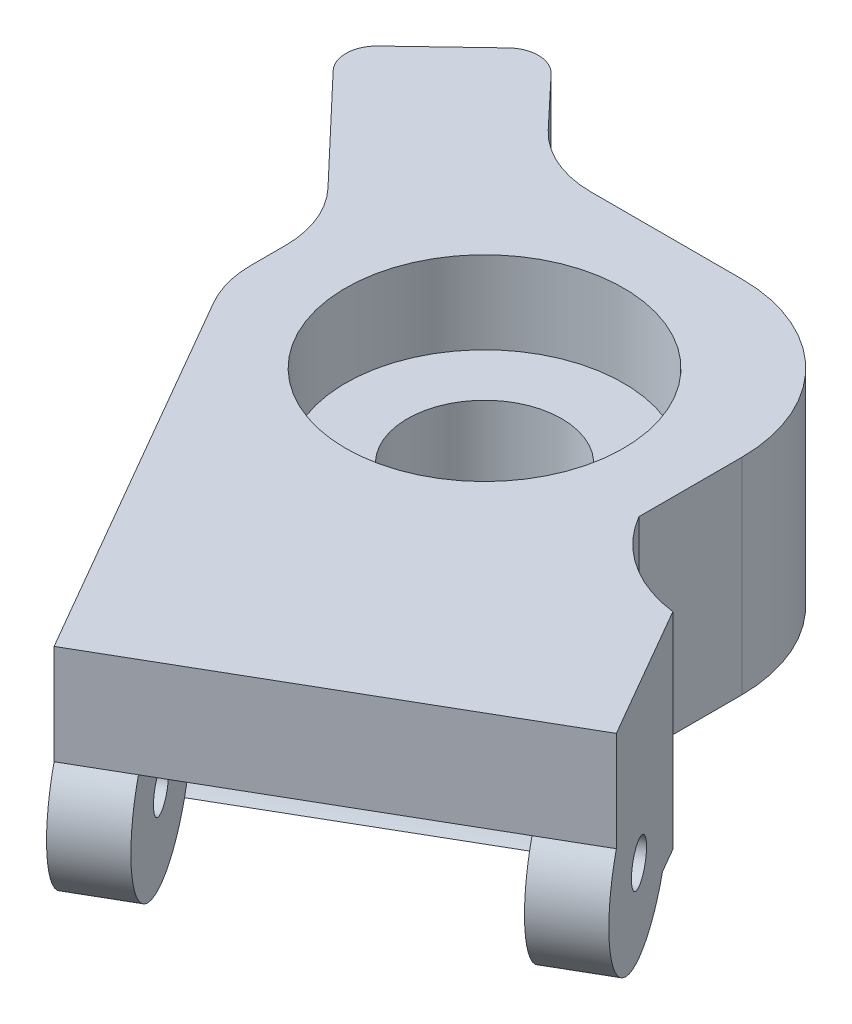
ISO-10303-21;
HEADER;
FILE_DESCRIPTION(('STEP AP214'),'2;1');
FILE_NAME('part.step','',(''),(''),'','','');
FILE_SCHEMA(('AUTOMOTIVE_DESIGN { 1 0 10303 214 1 1 1 1 }'));
ENDSEC;
DATA;
#1=APPLICATION_CONTEXT('core data for automotive mechanical design processes');
#2=APPLICATION_PROTOCOL_DEFINITION('international standard','automotive_design',2000,#1);
#3=PRODUCT_CONTEXT('',#1,'mechanical');
#4=PRODUCT('Part','Part','',(#3));
#5=PRODUCT_RELATED_PRODUCT_CATEGORY('part','',(#4));
#6=PRODUCT_DEFINITION_FORMATION('','',#4);
#7=PRODUCT_DEFINITION_CONTEXT('part definition',#1,'design');
#8=PRODUCT_DEFINITION('design','',#6,#7);
#9=PRODUCT_DEFINITION_SHAPE('','',#8);
#10=(LENGTH_UNIT() NAMED_UNIT(*) SI_UNIT(.MILLI.,.METRE.));
#11=(NAMED_UNIT(*) PLANE_ANGLE_UNIT() SI_UNIT($,.RADIAN.));
#12=(NAMED_UNIT(*) SI_UNIT($,.STERADIAN.) SOLID_ANGLE_UNIT());
#13=UNCERTAINTY_MEASURE_WITH_UNIT(LENGTH_MEASURE(1.E-05),#10,'distance_accuracy_value','');
#14=(GEOMETRIC_REPRESENTATION_CONTEXT(3) GLOBAL_UNCERTAINTY_ASSIGNED_CONTEXT((#13)) GLOBAL_UNIT_ASSIGNED_CONTEXT((#10,
#11,#12)) REPRESENTATION_CONTEXT('',''));
#15=CARTESIAN_POINT('',(0.,0.,0.));
#16=DIRECTION('',(0.,0.,1.));
#17=DIRECTION('',(1.,0.,0.));
#18=AXIS2_PLACEMENT_3D('',#15,#16,#17);
#19=CARTESIAN_POINT('',(-52.4615242270662,-7.,69.1339745962157));
#20=DIRECTION('',(0.866025403784437,0.,-0.500000000000003));
#21=DIRECTION('',(-0.500000000000003,0.,-0.866025403784437));
#22=AXIS2_PLACEMENT_3D('',#19,#20,#21);
#23=CYLINDRICAL_SURFACE('',#22,2.);
#24=CARTESIAN_POINT('',(-0.499999999999966,-7.,39.1339745962155));
#25=DIRECTION('',(0.866025403784438,0.,-0.500000000000002));
#26=DIRECTION('',(-0.500000000000002,0.,-0.866025403784438));
#27=AXIS2_PLACEMENT_3D('',#24,#25,#26);
#28=CIRCLE('',#27,2.);
#29=CARTESIAN_POINT('',(-1.49999999999997,-7.,37.4019237886466));
#30=VERTEX_POINT('',#29);
#31=EDGE_CURVE('E200',#30,#30,#28,.T.);
#32=ORIENTED_EDGE('',*,*,#31,.F.);
#33=EDGE_LOOP('',(#32));
#34=FACE_BOUND('',#33,.T.);
#35=CARTESIAN_POINT('',(4.69615242270667,-7.,36.1339745962155));
#36=DIRECTION('',(0.866025403784438,0.,-0.500000000000002));
#37=DIRECTION('',(-0.500000000000002,0.,-0.866025403784438));
#38=AXIS2_PLACEMENT_3D('',#35,#36,#37);
#39=CIRCLE('',#38,2.);
#40=CARTESIAN_POINT('',(3.69615242270666,-7.,34.4019237886466));
#41=VERTEX_POINT('',#40);
#42=EDGE_CURVE('E380',#41,#41,#39,.F.);
#43=ORIENTED_EDGE('',*,*,#42,.F.);
#44=EDGE_LOOP('',(#43));
#45=FACE_BOUND('',#44,.T.);
#46=ADVANCED_FACE('F35',(#34,#45),#23,.F.);
#47=CARTESIAN_POINT('',(-0.5,-7.,39.1339745962155));
#48=DIRECTION('',(0.866025403784438,0.,-0.500000000000002));
#49=DIRECTION('',(-0.500000000000002,0.,-0.866025403784438));
#50=AXIS2_PLACEMENT_3D('',#47,#48,#49);
#51=CYLINDRICAL_SURFACE('',#50,8.);
#52=DIRECTION('',(0.866025403784438,0.,-0.500000000000002));
#53=VECTOR('',#52,1.);
#54=CARTESIAN_POINT('',(-3.62249899919921,-12.,33.7256476830195));
#55=LINE('',#54,#53);
#56=CARTESIAN_POINT('',(1.57365342350746,-12.,30.7256476830195));
#57=VERTEX_POINT('',#56);
#58=CARTESIAN_POINT('',(-3.62249899919919,-12.,33.7256476830195));
#59=VERTEX_POINT('',#58);
#60=EDGE_CURVE('E281',#57,#59,#55,.F.);
#61=ORIENTED_EDGE('',*,*,#60,.F.);
#62=CARTESIAN_POINT('',(4.69615242270667,-7.,36.1339745962155));
#63=DIRECTION('',(0.866025403784438,0.,-0.500000000000002));
#64=DIRECTION('',(-0.500000000000002,0.,-0.866025403784438));
#65=AXIS2_PLACEMENT_3D('',#62,#63,#64);
#66=CIRCLE('',#65,7.99999999999999);
#67=CARTESIAN_POINT('',(7.69615242270665,-1.70849737787076,41.3301270189221));
#68=VERTEX_POINT('',#67);
#69=EDGE_CURVE('E388',#68,#57,#66,.T.);
#70=ORIENTED_EDGE('',*,*,#69,.F.);
#71=DIRECTION('',(0.866025403784438,0.,-0.500000000000002));
#72=VECTOR('',#71,1.);
#73=CARTESIAN_POINT('',(2.49999999999999,-1.70849737787078,44.3301270189221));
#74=LINE('',#73,#72);
#75=CARTESIAN_POINT('',(2.50000000000001,-1.70849737787077,44.3301270189221));
#76=VERTEX_POINT('',#75);
#77=EDGE_CURVE('E190',#76,#68,#74,.T.);
#78=ORIENTED_EDGE('',*,*,#77,.F.);
#79=CARTESIAN_POINT('',(-0.5,-7.,39.1339745962155));
#80=DIRECTION('',(0.866025403784438,0.,-0.500000000000002));
#81=DIRECTION('',(-0.500000000000002,0.,-0.866025403784438));
#82=AXIS2_PLACEMENT_3D('',#79,#80,#81);
#83=CIRCLE('',#82,8.);
#84=EDGE_CURVE('E188',#76,#59,#83,.T.);
#85=ORIENTED_EDGE('',*,*,#84,.T.);
#86=EDGE_LOOP('',(#61,#70,#78,#85));
#87=FACE_BOUND('',#86,.T.);
#88=ADVANCED_FACE('F397',(#87),#51,.T.);
#89=CARTESIAN_POINT('',(5.,8.,-5.));
#90=DIRECTION('',(0.,1.,0.));
#91=DIRECTION('',(0.,0.,1.));
#92=AXIS2_PLACEMENT_3D('',#89,#90,#91);
#93=PLANE('',#92);
#94=DIRECTION('',(-0.724880334749482,0.,0.688874807416761));
#95=VECTOR('',#94,1.);
#96=CARTESIAN_POINT('',(-34.466370955752,8.,-19.8635031811167));
#97=LINE('',#96,#95);
#98=CARTESIAN_POINT('',(-25.7787544463453,8.,-28.1195971361231));
#99=VERTEX_POINT('',#98);
#100=CARTESIAN_POINT('',(-32.2917299515036,8.,-21.930127603367));
#101=VERTEX_POINT('',#100);
#102=EDGE_CURVE('E250',#99,#101,#97,.T.);
#103=ORIENTED_EDGE('',*,*,#102,.T.);
#104=CARTESIAN_POINT('',(-30.2251055292533,8.,-19.7554865991186));
#105=DIRECTION('',(0.,1.,0.));
#106=DIRECTION('',(0.,0.,1.));
#107=AXIS2_PLACEMENT_3D('',#104,#105,#106);
#108=CIRCLE('',#107,3.);
#109=CARTESIAN_POINT('',(-32.3997465335018,8.,-17.6888621768683));
#110=VERTEX_POINT('',#109);
#111=EDGE_CURVE('E43',#101,#110,#108,.T.);
#112=ORIENTED_EDGE('',*,*,#111,.T.);
#113=DIRECTION('',(0.68887480741676,0.,0.724880334749482));
#114=VECTOR('',#113,1.);
#115=CARTESIAN_POINT('',(-34.466370955752,8.,-19.8635031811167));
#116=LINE('',#115,#114);
#117=CARTESIAN_POINT('',(-22.7511966525053,8.,-7.53601002974002));
#118=VERTEX_POINT('',#117);
#119=EDGE_CURVE('E253',#110,#118,#116,.T.);
#120=ORIENTED_EDGE('',*,*,#119,.T.);
#121=CARTESIAN_POINT('',(-30.0000000000001,8.,-0.647261955572413));
#122=DIRECTION('',(0.,1.,0.));
#123=DIRECTION('',(0.,0.,1.));
#124=AXIS2_PLACEMENT_3D('',#121,#122,#123);
#125=CIRCLE('',#124,10.);
#126=CARTESIAN_POINT('',(-20.0000000000001,8.,-0.647261955572417));
#127=VERTEX_POINT('',#126);
#128=EDGE_CURVE('E310',#118,#127,#125,.F.);
#129=ORIENTED_EDGE('',*,*,#128,.T.);
#130=DIRECTION('',(0.,0.,1.));
#131=VECTOR('',#130,1.);
#132=CARTESIAN_POINT('',(-20.0000000000001,8.,-4.6410161513776));
#133=LINE('',#132,#131);
#134=CARTESIAN_POINT('',(-20.0000000000001,8.,2.67949192431115));
#135=VERTEX_POINT('',#134);
#136=EDGE_CURVE('E255',#127,#135,#133,.T.);
#137=ORIENTED_EDGE('',*,*,#136,.T.);
#138=CARTESIAN_POINT('',(-10.0000000000001,8.,2.67949192431115));
#139=DIRECTION('',(0.,1.,0.));
#140=DIRECTION('',(0.,0.,1.));
#141=AXIS2_PLACEMENT_3D('',#138,#139,#140);
#142=CIRCLE('',#141,10.);
#143=CARTESIAN_POINT('',(-18.6602540378445,8.,7.67949192431117));
#144=VERTEX_POINT('',#143);
#145=EDGE_CURVE('E302',#135,#144,#142,.T.);
#146=ORIENTED_EDGE('',*,*,#145,.T.);
#147=DIRECTION('',(0.500000000000002,0.,0.866025403784438));
#148=VECTOR('',#147,1.);
#149=CARTESIAN_POINT('',(2.50000000000001,8.,44.3301270189221));
#150=LINE('',#149,#148);
#151=CARTESIAN_POINT('',(2.50000000000001,8.,44.3301270189221));
#152=VERTEX_POINT('',#151);
#153=EDGE_CURVE('E258',#144,#152,#150,.T.);
#154=ORIENTED_EDGE('',*,*,#153,.T.);
#155=DIRECTION('',(0.866025403784438,0.,-0.500000000000001));
#156=VECTOR('',#155,1.);
#157=CARTESIAN_POINT('',(2.50000000000001,8.,44.3301270189221));
#158=LINE('',#157,#156);
#159=CARTESIAN_POINT('',(37.1410161513775,8.,24.330127018922));
#160=VERTEX_POINT('',#159);
#161=EDGE_CURVE('E260',#152,#160,#158,.T.);
#162=ORIENTED_EDGE('',*,*,#161,.T.);
#163=DIRECTION('',(-0.500000000000002,0.,-0.866025403784438));
#164=VECTOR('',#163,1.);
#165=CARTESIAN_POINT('',(37.1410161513775,8.,24.330127018922));
#166=LINE('',#165,#164);
#167=CARTESIAN_POINT('',(29.6410161513775,8.,11.3397459621555));
#168=VERTEX_POINT('',#167);
#169=EDGE_CURVE('E262',#160,#168,#166,.T.);
#170=ORIENTED_EDGE('',*,*,#169,.T.);
#171=CARTESIAN_POINT('',(31.2212204760018,8.,-1.56385641440739));
#172=DIRECTION('',(0.,-1.,0.));
#173=DIRECTION('',(0.,0.,1.));
#174=AXIS2_PLACEMENT_3D('',#171,#172,#173);
#175=CIRCLE('',#174,13.);
#176=CARTESIAN_POINT('',(19.9999999999999,8.,5.));
#177=VERTEX_POINT('',#176);
#178=EDGE_CURVE('E264',#168,#177,#175,.T.);
#179=ORIENTED_EDGE('',*,*,#178,.T.);
#180=DIRECTION('',(0.,0.,-1.));
#181=VECTOR('',#180,1.);
#182=CARTESIAN_POINT('',(20.,8.,-4.9999999999999));
#183=LINE('',#182,#181);
#184=CARTESIAN_POINT('',(20.,8.,-4.9999999999999));
#185=VERTEX_POINT('',#184);
#186=EDGE_CURVE('E266',#177,#185,#183,.T.);
#187=ORIENTED_EDGE('',*,*,#186,.T.);
#188=CARTESIAN_POINT('',(5.,8.,-5.));
#189=DIRECTION('',(0.,1.,0.));
#190=DIRECTION('',(0.,0.,1.));
#191=AXIS2_PLACEMENT_3D('',#188,#189,#190);
#192=CIRCLE('',#191,15.);
#193=CARTESIAN_POINT('',(4.9999999999999,8.,-20.));
#194=VERTEX_POINT('',#193);
#195=EDGE_CURVE('E240',#185,#194,#192,.T.);
#196=ORIENTED_EDGE('',*,*,#195,.T.);
#197=DIRECTION('',(-1.,0.,0.));
#198=VECTOR('',#197,1.);
#199=CARTESIAN_POINT('',(-14.,8.,-20.));
#200=LINE('',#199,#198);
#201=CARTESIAN_POINT('',(-9.67814454377507,8.,-20.));
#202=VERTEX_POINT('',#201);
#203=EDGE_CURVE('E245',#194,#202,#200,.T.);
#204=ORIENTED_EDGE('',*,*,#203,.T.);
#205=CARTESIAN_POINT('',(-9.67814454377507,8.,-30.));
#206=DIRECTION('',(0.,1.,0.));
#207=DIRECTION('',(0.,0.,1.));
#208=AXIS2_PLACEMENT_3D('',#205,#206,#207);
#209=CIRCLE('',#208,10.);
#210=CARTESIAN_POINT('',(-16.961448324038,8.,-23.1477386182073));
#211=VERTEX_POINT('',#210);
#212=EDGE_CURVE('E306',#202,#211,#209,.F.);
#213=ORIENTED_EDGE('',*,*,#212,.T.);
#214=DIRECTION('',(-0.68522613817927,0.,-0.728330378026294));
#215=VECTOR('',#214,1.);
#216=CARTESIAN_POINT('',(-14.,8.,-20.));
#217=LINE('',#216,#215);
#218=CARTESIAN_POINT('',(-21.5271388900162,8.,-28.0006345464125));
#219=VERTEX_POINT('',#218);
#220=EDGE_CURVE('E248',#211,#219,#217,.T.);
#221=ORIENTED_EDGE('',*,*,#220,.T.);
#222=CARTESIAN_POINT('',(-23.7121300240951,8.,-25.9449561318747));
#223=DIRECTION('',(0.,1.,0.));
#224=DIRECTION('',(0.,0.,1.));
#225=AXIS2_PLACEMENT_3D('',#222,#223,#224);
#226=CIRCLE('',#225,3.);
#227=EDGE_CURVE('E324',#219,#99,#226,.T.);
#228=ORIENTED_EDGE('',*,*,#227,.T.);
#229=EDGE_LOOP('',(#103,#112,#120,#129,#137,#146,#154,#162,#170,#179,#187,#196,#204,#213,#221,#228));
#230=FACE_BOUND('',#229,.T.);
#231=CARTESIAN_POINT('',(0.,8.,0.));
#232=DIRECTION('',(0.,1.,0.));
#233=DIRECTION('',(0.,0.,1.));
#234=AXIS2_PLACEMENT_3D('',#231,#232,#233);
#235=CIRCLE('',#234,13.5);
#236=CARTESIAN_POINT('',(0.,8.,13.5));
#237=VERTEX_POINT('',#236);
#238=EDGE_CURVE('E237',#237,#237,#235,.T.);
#239=ORIENTED_EDGE('',*,*,#238,.F.);
#240=EDGE_LOOP('',(#239));
#241=FACE_BOUND('',#240,.T.);
#242=ADVANCED_FACE('F328',(#230,#241),#93,.T.);
#243=CARTESIAN_POINT('',(5.,8.,-5.));
#244=DIRECTION('',(0.,-1.,0.));
#245=DIRECTION('',(0.,0.,-1.));
#246=AXIS2_PLACEMENT_3D('',#243,#244,#245);
#247=CYLINDRICAL_SURFACE('',#246,15.);
#248=DIRECTION('',(0.,-1.,0.));
#249=VECTOR('',#248,1.);
#250=CARTESIAN_POINT('',(20.,8.,-4.9999999999999));
#251=LINE('',#250,#249);
#252=CARTESIAN_POINT('',(20.,-12.,-5.));
#253=VERTEX_POINT('',#252);
#254=EDGE_CURVE('E268',#185,#253,#251,.T.);
#255=ORIENTED_EDGE('',*,*,#254,.T.);
#256=CARTESIAN_POINT('',(5.,-12.,-5.));
#257=DIRECTION('',(0.,-1.,0.));
#258=DIRECTION('',(0.,0.,1.));
#259=AXIS2_PLACEMENT_3D('',#256,#257,#258);
#260=CIRCLE('',#259,15.);
#261=CARTESIAN_POINT('',(5.00000000000001,-12.,-20.));
#262=VERTEX_POINT('',#261);
#263=EDGE_CURVE('E225',#262,#253,#260,.T.);
#264=ORIENTED_EDGE('',*,*,#263,.F.);
#265=DIRECTION('',(0.,-1.,0.));
#266=VECTOR('',#265,1.);
#267=CARTESIAN_POINT('',(4.9999999999999,8.,-20.));
#268=LINE('',#267,#266);
#269=EDGE_CURVE('E278',#194,#262,#268,.T.);
#270=ORIENTED_EDGE('',*,*,#269,.F.);
#271=ORIENTED_EDGE('',*,*,#195,.F.);
#272=EDGE_LOOP('',(#255,#264,#270,#271));
#273=FACE_BOUND('',#272,.T.);
#274=ADVANCED_FACE('F363',(#273),#247,.T.);
#275=CARTESIAN_POINT('',(-14.,8.,-20.));
#276=DIRECTION('',(0.,0.,1.));
#277=DIRECTION('',(1.,0.,0.));
#278=AXIS2_PLACEMENT_3D('',#275,#276,#277);
#279=PLANE('',#278);
#280=DIRECTION('',(1.,0.,0.));
#281=VECTOR('',#280,1.);
#282=CARTESIAN_POINT('',(5.00000000000001,-12.,-20.));
#283=LINE('',#282,#281);
#284=CARTESIAN_POINT('',(-9.67814454377507,-12.,-20.));
#285=VERTEX_POINT('',#284);
#286=EDGE_CURVE('E223',#285,#262,#283,.T.);
#287=ORIENTED_EDGE('',*,*,#286,.F.);
#288=DIRECTION('',(0.,-1.,0.));
#289=VECTOR('',#288,1.);
#290=CARTESIAN_POINT('',(-9.67814454377507,8.,-20.));
#291=LINE('',#290,#289);
#292=EDGE_CURVE('E287',#285,#202,#291,.F.);
#293=ORIENTED_EDGE('',*,*,#292,.T.);
#294=ORIENTED_EDGE('',*,*,#203,.F.);
#295=ORIENTED_EDGE('',*,*,#269,.T.);
#296=EDGE_LOOP('',(#287,#293,#294,#295));
#297=FACE_BOUND('',#296,.T.);
#298=ADVANCED_FACE('F358',(#297),#279,.F.);
#299=CARTESIAN_POINT('',(-14.,8.,-20.));
#300=DIRECTION('',(-0.728330378026294,0.,0.68522613817927));
#301=DIRECTION('',(0.68522613817927,0.,0.728330378026294));
#302=AXIS2_PLACEMENT_3D('',#299,#300,#301);
#303=PLANE('',#302);
#304=DIRECTION('',(0.68522613817927,0.,0.728330378026293));
#305=VECTOR('',#304,1.);
#306=CARTESIAN_POINT('',(-14.,-12.,-20.));
#307=LINE('',#306,#305);
#308=CARTESIAN_POINT('',(-21.5271388900162,-12.,-28.0006345464125));
#309=VERTEX_POINT('',#308);
#310=CARTESIAN_POINT('',(-16.961448324038,-12.,-23.1477386182073));
#311=VERTEX_POINT('',#310);
#312=EDGE_CURVE('E221',#309,#311,#307,.T.);
#313=ORIENTED_EDGE('',*,*,#312,.F.);
#314=DIRECTION('',(0.,-1.,0.));
#315=VECTOR('',#314,1.);
#316=CARTESIAN_POINT('',(-21.5271388900162,8.,-28.0006345464125));
#317=LINE('',#316,#315);
#318=EDGE_CURVE('E11',#309,#219,#317,.F.);
#319=ORIENTED_EDGE('',*,*,#318,.T.);
#320=ORIENTED_EDGE('',*,*,#220,.F.);
#321=DIRECTION('',(0.,-1.,0.));
#322=VECTOR('',#321,1.);
#323=CARTESIAN_POINT('',(-16.961448324038,-12.,-23.1477386182073));
#324=LINE('',#323,#322);
#325=EDGE_CURVE('E284',#211,#311,#324,.T.);
#326=ORIENTED_EDGE('',*,*,#325,.T.);
#327=EDGE_LOOP('',(#313,#319,#320,#326));
#328=FACE_BOUND('',#327,.T.);
#329=ADVANCED_FACE('F350',(#328),#303,.F.);
#330=CARTESIAN_POINT('',(-34.466370955752,8.,-19.8635031811167));
#331=DIRECTION('',(0.688874807416761,0.,0.724880334749482));
#332=DIRECTION('',(0.724880334749482,0.,-0.688874807416761));
#333=AXIS2_PLACEMENT_3D('',#330,#331,#332);
#334=PLANE('',#333);
#335=DIRECTION('',(0.724880334749482,0.,-0.68887480741676));
#336=VECTOR('',#335,1.);
#337=CARTESIAN_POINT('',(-23.5931659345098,-12.,-30.1966252923681));
#338=LINE('',#337,#336);
#339=CARTESIAN_POINT('',(-32.2917299515036,-12.,-21.930127603367));
#340=VERTEX_POINT('',#339);
#341=CARTESIAN_POINT('',(-25.7787544463453,-12.,-28.1195971361231));
#342=VERTEX_POINT('',#341);
#343=EDGE_CURVE('E218',#340,#342,#338,.T.);
#344=ORIENTED_EDGE('',*,*,#343,.F.);
#345=DIRECTION('',(0.,-1.,0.));
#346=VECTOR('',#345,1.);
#347=CARTESIAN_POINT('',(-32.2917299515036,8.,-21.930127603367));
#348=LINE('',#347,#346);
#349=EDGE_CURVE('E322',#340,#101,#348,.F.);
#350=ORIENTED_EDGE('',*,*,#349,.T.);
#351=ORIENTED_EDGE('',*,*,#102,.F.);
#352=DIRECTION('',(0.,-1.,0.));
#353=VECTOR('',#352,1.);
#354=CARTESIAN_POINT('',(-25.7787544463453,8.,-28.1195971361231));
#355=LINE('',#354,#353);
#356=EDGE_CURVE('E319',#99,#342,#355,.T.);
#357=ORIENTED_EDGE('',*,*,#356,.T.);
#358=EDGE_LOOP('',(#344,#350,#351,#357));
#359=FACE_BOUND('',#358,.T.);
#360=ADVANCED_FACE('F345',(#359),#334,.F.);
#361=CARTESIAN_POINT('',(-34.466370955752,8.,-19.8635031811167));
#362=DIRECTION('',(0.724880334749482,0.,-0.68887480741676));
#363=DIRECTION('',(-0.68887480741676,0.,-0.724880334749482));
#364=AXIS2_PLACEMENT_3D('',#361,#362,#363);
#365=PLANE('',#364);
#366=ORIENTED_EDGE('',*,*,#119,.F.);
#367=DIRECTION('',(0.,-1.,0.));
#368=VECTOR('',#367,1.);
#369=CARTESIAN_POINT('',(-32.3997465335018,8.,-17.6888621768683));
#370=LINE('',#369,#368);
#371=CARTESIAN_POINT('',(-32.3997465335018,-12.,-17.6888621768683));
#372=VERTEX_POINT('',#371);
#373=EDGE_CURVE('E312',#110,#372,#370,.T.);
#374=ORIENTED_EDGE('',*,*,#373,.T.);
#375=DIRECTION('',(-0.68887480741676,0.,-0.724880334749483));
#376=VECTOR('',#375,1.);
#377=CARTESIAN_POINT('',(-34.466370955752,-12.,-19.8635031811167));
#378=LINE('',#377,#376);
#379=CARTESIAN_POINT('',(-22.7511966525053,-12.,-7.53601002974001));
#380=VERTEX_POINT('',#379);
#381=EDGE_CURVE('E215',#380,#372,#378,.T.);
#382=ORIENTED_EDGE('',*,*,#381,.F.);
#383=DIRECTION('',(0.,-1.,0.));
#384=VECTOR('',#383,1.);
#385=CARTESIAN_POINT('',(-22.7511966525053,8.,-7.53601002974002));
#386=LINE('',#385,#384);
#387=EDGE_CURVE('E294',#380,#118,#386,.F.);
#388=ORIENTED_EDGE('',*,*,#387,.T.);
#389=EDGE_LOOP('',(#366,#374,#382,#388));
#390=FACE_BOUND('',#389,.T.);
#391=ADVANCED_FACE('F335',(#390),#365,.F.);
#392=CARTESIAN_POINT('',(-20.0000000000001,8.,-4.6410161513776));
#393=DIRECTION('',(1.,0.,0.));
#394=DIRECTION('',(0.,0.,-1.));
#395=AXIS2_PLACEMENT_3D('',#392,#393,#394);
#396=PLANE('',#395);
#397=ORIENTED_EDGE('',*,*,#136,.F.);
#398=DIRECTION('',(0.,-1.,0.));
#399=VECTOR('',#398,1.);
#400=CARTESIAN_POINT('',(-20.0000000000001,-12.,-0.647261955572417));
#401=LINE('',#400,#399);
#402=CARTESIAN_POINT('',(-20.0000000000001,-12.,-0.647261955572417));
#403=VERTEX_POINT('',#402);
#404=EDGE_CURVE('E291',#127,#403,#401,.T.);
#405=ORIENTED_EDGE('',*,*,#404,.T.);
#406=DIRECTION('',(0.,0.,-1.));
#407=VECTOR('',#406,1.);
#408=CARTESIAN_POINT('',(-20.0000000000001,-12.,5.3589838486224));
#409=LINE('',#408,#407);
#410=CARTESIAN_POINT('',(-20.0000000000001,-12.,2.67949192431115));
#411=VERTEX_POINT('',#410);
#412=EDGE_CURVE('E212',#411,#403,#409,.T.);
#413=ORIENTED_EDGE('',*,*,#412,.F.);
#414=DIRECTION('',(0.,-1.,0.));
#415=VECTOR('',#414,1.);
#416=CARTESIAN_POINT('',(-20.0000000000001,8.,2.67949192431115));
#417=LINE('',#416,#415);
#418=EDGE_CURVE('E289',#411,#135,#417,.F.);
#419=ORIENTED_EDGE('',*,*,#418,.T.);
#420=EDGE_LOOP('',(#397,#405,#413,#419));
#421=FACE_BOUND('',#420,.T.);
#422=ADVANCED_FACE('F413',(#421),#396,.F.);
#423=CARTESIAN_POINT('',(2.50000000000001,8.,44.3301270189221));
#424=DIRECTION('',(0.866025403784438,0.,-0.500000000000002));
#425=DIRECTION('',(-0.500000000000002,0.,-0.866025403784438));
#426=AXIS2_PLACEMENT_3D('',#423,#424,#425);
#427=PLANE('',#426);
#428=ORIENTED_EDGE('',*,*,#153,.F.);
#429=DIRECTION('',(0.,-1.,0.));
#430=VECTOR('',#429,1.);
#431=CARTESIAN_POINT('',(-18.6602540378445,8.,7.67949192431117));
#432=LINE('',#431,#430);
#433=CARTESIAN_POINT('',(-18.6602540378445,-12.,7.67949192431117));
#434=VERTEX_POINT('',#433);
#435=EDGE_CURVE('E297',#144,#434,#432,.T.);
#436=ORIENTED_EDGE('',*,*,#435,.T.);
#437=DIRECTION('',(-0.500000000000002,0.,-0.866025403784438));
#438=VECTOR('',#437,1.);
#439=CARTESIAN_POINT('',(-20.0000000000001,-12.,5.3589838486224));
#440=LINE('',#439,#438);
#441=EDGE_CURVE('E207',#59,#434,#440,.T.);
#442=ORIENTED_EDGE('',*,*,#441,.F.);
#443=ORIENTED_EDGE('',*,*,#84,.F.);
#444=DIRECTION('',(0.,-1.,0.));
#445=VECTOR('',#444,1.);
#446=CARTESIAN_POINT('',(2.50000000000001,8.,44.3301270189221));
#447=LINE('',#446,#445);
#448=EDGE_CURVE('E276',#152,#76,#447,.T.);
#449=ORIENTED_EDGE('',*,*,#448,.F.);
#450=EDGE_LOOP('',(#428,#436,#442,#443,#449));
#451=FACE_BOUND('',#450,.T.);
#452=ORIENTED_EDGE('',*,*,#31,.T.);
#453=EDGE_LOOP('',(#452));
#454=FACE_BOUND('',#453,.T.);
#455=ADVANCED_FACE('F402',(#451,#454),#427,.F.);
#456=CARTESIAN_POINT('',(2.50000000000001,8.,44.3301270189221));
#457=DIRECTION('',(-0.500000000000001,0.,-0.866025403784438));
#458=DIRECTION('',(-0.866025403784438,0.,0.500000000000001));
#459=AXIS2_PLACEMENT_3D('',#456,#457,#458);
#460=PLANE('',#459);
#461=ORIENTED_EDGE('',*,*,#448,.T.);
#462=ORIENTED_EDGE('',*,*,#77,.T.);
#463=CARTESIAN_POINT('',(31.9448637286709,-1.70849737787076,27.330127018922));
#464=VERTEX_POINT('',#463);
#465=EDGE_CURVE('E166',#68,#464,#74,.T.);
#466=ORIENTED_EDGE('',*,*,#465,.T.);
#467=CARTESIAN_POINT('',(37.1410161513775,-1.70849737787078,24.330127018922));
#468=VERTEX_POINT('',#467);
#469=EDGE_CURVE('E181',#464,#468,#74,.T.);
#470=ORIENTED_EDGE('',*,*,#469,.T.);
#471=DIRECTION('',(0.,-1.,0.));
#472=VECTOR('',#471,1.);
#473=CARTESIAN_POINT('',(37.1410161513775,8.,24.330127018922));
#474=LINE('',#473,#472);
#475=EDGE_CURVE('E274',#160,#468,#474,.T.);
#476=ORIENTED_EDGE('',*,*,#475,.F.);
#477=ORIENTED_EDGE('',*,*,#161,.F.);
#478=EDGE_LOOP('',(#461,#462,#466,#470,#476,#477));
#479=FACE_BOUND('',#478,.T.);
#480=ADVANCED_FACE('F192',(#479),#460,.F.);
#481=CARTESIAN_POINT('',(37.1410161513775,8.,24.330127018922));
#482=DIRECTION('',(-0.866025403784438,0.,0.500000000000002));
#483=DIRECTION('',(0.500000000000002,0.,0.866025403784438));
#484=AXIS2_PLACEMENT_3D('',#481,#482,#483);
#485=PLANE('',#484);
#486=ORIENTED_EDGE('',*,*,#475,.T.);
#487=CARTESIAN_POINT('',(34.1410161513775,-7.,19.1339745962154));
#488=DIRECTION('',(0.866025403784438,0.,-0.500000000000002));
#489=DIRECTION('',(-0.500000000000002,0.,-0.866025403784438));
#490=AXIS2_PLACEMENT_3D('',#487,#488,#489);
#491=CIRCLE('',#490,8.);
#492=CARTESIAN_POINT('',(31.0185171521783,-12.,13.7256476830195));
#493=VERTEX_POINT('',#492);
#494=EDGE_CURVE('E184',#468,#493,#491,.T.);
#495=ORIENTED_EDGE('',*,*,#494,.T.);
#496=DIRECTION('',(0.500000000000002,0.,0.866025403784437));
#497=VECTOR('',#496,1.);
#498=CARTESIAN_POINT('',(37.1410161513775,-12.,24.330127018922));
#499=LINE('',#498,#497);
#500=CARTESIAN_POINT('',(29.6410161513775,-12.,11.3397459621555));
#501=VERTEX_POINT('',#500);
#502=EDGE_CURVE('E234',#501,#493,#499,.T.);
#503=ORIENTED_EDGE('',*,*,#502,.F.);
#504=DIRECTION('',(0.,-1.,0.));
#505=VECTOR('',#504,1.);
#506=CARTESIAN_POINT('',(29.6410161513775,8.,11.3397459621555));
#507=LINE('',#506,#505);
#508=EDGE_CURVE('E272',#168,#501,#507,.T.);
#509=ORIENTED_EDGE('',*,*,#508,.F.);
#510=ORIENTED_EDGE('',*,*,#169,.F.);
#511=EDGE_LOOP('',(#486,#495,#503,#509,#510));
#512=FACE_BOUND('',#511,.T.);
#513=CARTESIAN_POINT('',(34.1410161513775,-7.,19.1339745962154));
#514=DIRECTION('',(0.866025403784437,0.,-0.500000000000003));
#515=DIRECTION('',(-0.500000000000003,0.,-0.866025403784437));
#516=AXIS2_PLACEMENT_3D('',#513,#514,#515);
#517=CIRCLE('',#516,2.);
#518=CARTESIAN_POINT('',(33.1410161513775,-7.,17.4019237886465));
#519=VERTEX_POINT('',#518);
#520=EDGE_CURVE('E194',#519,#519,#517,.T.);
#521=ORIENTED_EDGE('',*,*,#520,.F.);
#522=EDGE_LOOP('',(#521));
#523=FACE_BOUND('',#522,.T.);
#524=ADVANCED_FACE('F377',(#512,#523),#485,.F.);
#525=CARTESIAN_POINT('',(31.2212204760018,8.,-1.56385641440739));
#526=DIRECTION('',(0.,-1.,0.));
#527=DIRECTION('',(0.,0.,-1.));
#528=AXIS2_PLACEMENT_3D('',#525,#526,#527);
#529=CYLINDRICAL_SURFACE('',#528,13.);
#530=ORIENTED_EDGE('',*,*,#508,.T.);
#531=CARTESIAN_POINT('',(31.2212204760018,-12.,-1.56385641440739));
#532=DIRECTION('',(0.,1.,0.));
#533=DIRECTION('',(0.,0.,1.));
#534=AXIS2_PLACEMENT_3D('',#531,#532,#533);
#535=CIRCLE('',#534,13.);
#536=CARTESIAN_POINT('',(19.9999999999999,-12.,5.));
#537=VERTEX_POINT('',#536);
#538=EDGE_CURVE('E231',#537,#501,#535,.T.);
#539=ORIENTED_EDGE('',*,*,#538,.F.);
#540=DIRECTION('',(0.,-1.,0.));
#541=VECTOR('',#540,1.);
#542=CARTESIAN_POINT('',(19.9999999999999,8.,5.));
#543=LINE('',#542,#541);
#544=EDGE_CURVE('E270',#177,#537,#543,.T.);
#545=ORIENTED_EDGE('',*,*,#544,.F.);
#546=ORIENTED_EDGE('',*,*,#178,.F.);
#547=EDGE_LOOP('',(#530,#539,#545,#546));
#548=FACE_BOUND('',#547,.T.);
#549=ADVANCED_FACE('F373',(#548),#529,.F.);
#550=CARTESIAN_POINT('',(20.,8.,-4.9999999999999));
#551=DIRECTION('',(-1.,0.,0.));
#552=DIRECTION('',(0.,0.,1.));
#553=AXIS2_PLACEMENT_3D('',#550,#551,#552);
#554=PLANE('',#553);
#555=ORIENTED_EDGE('',*,*,#544,.T.);
#556=DIRECTION('',(0.,0.,1.));
#557=VECTOR('',#556,1.);
#558=CARTESIAN_POINT('',(19.9999999999999,-12.,5.));
#559=LINE('',#558,#557);
#560=EDGE_CURVE('E228',#253,#537,#559,.T.);
#561=ORIENTED_EDGE('',*,*,#560,.F.);
#562=ORIENTED_EDGE('',*,*,#254,.F.);
#563=ORIENTED_EDGE('',*,*,#186,.F.);
#564=EDGE_LOOP('',(#555,#561,#562,#563));
#565=FACE_BOUND('',#564,.T.);
#566=ADVANCED_FACE('F368',(#565),#554,.F.);
#567=CARTESIAN_POINT('',(0.,8.,0.));
#568=DIRECTION('',(0.,-1.,0.));
#569=DIRECTION('',(0.,0.,-1.));
#570=AXIS2_PLACEMENT_3D('',#567,#568,#569);
#571=CYLINDRICAL_SURFACE('',#570,13.5);
#572=ORIENTED_EDGE('',*,*,#238,.T.);
#573=EDGE_LOOP('',(#572));
#574=FACE_BOUND('',#573,.T.);
#575=CARTESIAN_POINT('',(0.,0.,0.));
#576=DIRECTION('',(0.,1.,0.));
#577=DIRECTION('',(0.,0.,1.));
#578=AXIS2_PLACEMENT_3D('',#575,#576,#577);
#579=CIRCLE('',#578,13.5);
#580=CARTESIAN_POINT('',(0.,0.,13.5));
#581=VERTEX_POINT('',#580);
#582=EDGE_CURVE('E236',#581,#581,#579,.T.);
#583=ORIENTED_EDGE('',*,*,#582,.F.);
#584=EDGE_LOOP('',(#583));
#585=FACE_BOUND('',#584,.T.);
#586=ADVANCED_FACE('F478',(#574,#585),#571,.F.);
#587=CARTESIAN_POINT('',(31.2212204760018,0.,-1.56385641440739));
#588=DIRECTION('',(0.,1.,0.));
#589=DIRECTION('',(0.,0.,1.));
#590=AXIS2_PLACEMENT_3D('',#587,#588,#589);
#591=PLANE('',#590);
#592=CARTESIAN_POINT('',(0.,0.,0.));
#593=DIRECTION('',(0.,-1.,0.));
#594=DIRECTION('',(0.,0.,-1.));
#595=AXIS2_PLACEMENT_3D('',#592,#593,#594);
#596=CIRCLE('',#595,7.5);
#597=CARTESIAN_POINT('',(0.,0.,-7.5));
#598=VERTEX_POINT('',#597);
#599=EDGE_CURVE('E203',#598,#598,#596,.T.);
#600=ORIENTED_EDGE('',*,*,#599,.T.);
#601=EDGE_LOOP('',(#600));
#602=FACE_BOUND('',#601,.T.);
#603=ORIENTED_EDGE('',*,*,#582,.T.);
#604=EDGE_LOOP('',(#603));
#605=FACE_BOUND('',#604,.T.);
#606=ADVANCED_FACE('F484',(#602,#605),#591,.T.);
#607=CARTESIAN_POINT('',(31.2212204760018,-12.,-1.56385641440739));
#608=DIRECTION('',(0.,1.,0.));
#609=DIRECTION('',(0.,0.,1.));
#610=AXIS2_PLACEMENT_3D('',#607,#608,#609);
#611=PLANE('',#610);
#612=ORIENTED_EDGE('',*,*,#381,.T.);
#613=CARTESIAN_POINT('',(-30.2251055292533,-12.,-19.7554865991186));
#614=DIRECTION('',(0.,1.,0.));
#615=DIRECTION('',(0.,0.,1.));
#616=AXIS2_PLACEMENT_3D('',#613,#614,#615);
#617=CIRCLE('',#616,3.);
#618=EDGE_CURVE('E317',#372,#340,#617,.F.);
#619=ORIENTED_EDGE('',*,*,#618,.T.);
#620=ORIENTED_EDGE('',*,*,#343,.T.);
#621=CARTESIAN_POINT('',(-23.7121300240951,-12.,-25.9449561318747));
#622=DIRECTION('',(0.,1.,0.));
#623=DIRECTION('',(0.,0.,1.));
#624=AXIS2_PLACEMENT_3D('',#621,#622,#623);
#625=CIRCLE('',#624,3.);
#626=EDGE_CURVE('E315',#342,#309,#625,.F.);
#627=ORIENTED_EDGE('',*,*,#626,.T.);
#628=ORIENTED_EDGE('',*,*,#312,.T.);
#629=CARTESIAN_POINT('',(-9.67814454377507,-12.,-30.));
#630=DIRECTION('',(0.,1.,0.));
#631=DIRECTION('',(0.,0.,1.));
#632=AXIS2_PLACEMENT_3D('',#629,#630,#631);
#633=CIRCLE('',#632,10.);
#634=EDGE_CURVE('E304',#311,#285,#633,.T.);
#635=ORIENTED_EDGE('',*,*,#634,.T.);
#636=ORIENTED_EDGE('',*,*,#286,.T.);
#637=ORIENTED_EDGE('',*,*,#263,.T.);
#638=ORIENTED_EDGE('',*,*,#560,.T.);
#639=ORIENTED_EDGE('',*,*,#538,.T.);
#640=ORIENTED_EDGE('',*,*,#502,.T.);
#641=CARTESIAN_POINT('',(25.8223647294717,-12.,16.7256476830195));
#642=VERTEX_POINT('',#641);
#643=EDGE_CURVE('E282',#493,#642,#55,.F.);
#644=ORIENTED_EDGE('',*,*,#643,.T.);
#645=EDGE_CURVE('E169',#642,#57,#55,.F.);
#646=ORIENTED_EDGE('',*,*,#645,.T.);
#647=ORIENTED_EDGE('',*,*,#60,.T.);
#648=ORIENTED_EDGE('',*,*,#441,.T.);
#649=CARTESIAN_POINT('',(-10.0000000000001,-12.,2.67949192431115));
#650=DIRECTION('',(0.,1.,0.));
#651=DIRECTION('',(0.,0.,1.));
#652=AXIS2_PLACEMENT_3D('',#649,#650,#651);
#653=CIRCLE('',#652,10.);
#654=EDGE_CURVE('E300',#434,#411,#653,.F.);
#655=ORIENTED_EDGE('',*,*,#654,.T.);
#656=ORIENTED_EDGE('',*,*,#412,.T.);
#657=CARTESIAN_POINT('',(-30.0000000000001,-12.,-0.647261955572413));
#658=DIRECTION('',(0.,1.,0.));
#659=DIRECTION('',(0.,0.,1.));
#660=AXIS2_PLACEMENT_3D('',#657,#658,#659);
#661=CIRCLE('',#660,10.);
#662=EDGE_CURVE('E308',#403,#380,#661,.T.);
#663=ORIENTED_EDGE('',*,*,#662,.T.);
#664=EDGE_LOOP('',(#612,#619,#620,#627,#628,#635,#636,#637,#638,#639,#640,#644,#646,#647,#648,
#655,#656,#663));
#665=FACE_BOUND('',#664,.T.);
#666=CARTESIAN_POINT('',(0.,-12.,0.));
#667=DIRECTION('',(0.,-1.,0.));
#668=DIRECTION('',(0.,0.,-1.));
#669=AXIS2_PLACEMENT_3D('',#666,#667,#668);
#670=CIRCLE('',#669,7.5);
#671=CARTESIAN_POINT('',(0.,-12.,-7.5));
#672=VERTEX_POINT('',#671);
#673=EDGE_CURVE('E204',#672,#672,#670,.T.);
#674=ORIENTED_EDGE('',*,*,#673,.F.);
#675=EDGE_LOOP('',(#674));
#676=FACE_BOUND('',#675,.T.);
#677=ADVANCED_FACE('F342',(#665,#676),#611,.F.);
#678=CARTESIAN_POINT('',(0.,-12.,0.));
#679=DIRECTION('',(0.,1.,0.));
#680=DIRECTION('',(0.,0.,1.));
#681=AXIS2_PLACEMENT_3D('',#678,#679,#680);
#682=CYLINDRICAL_SURFACE('',#681,7.5);
#683=ORIENTED_EDGE('',*,*,#673,.T.);
#684=EDGE_LOOP('',(#683));
#685=FACE_BOUND('',#684,.T.);
#686=ORIENTED_EDGE('',*,*,#599,.F.);
#687=EDGE_LOOP('',(#686));
#688=FACE_BOUND('',#687,.T.);
#689=ADVANCED_FACE('F438',(#685,#688),#682,.F.);
#690=CARTESIAN_POINT('',(28.9448637286709,-7.,22.1339745962154));
#691=DIRECTION('',(0.866025403784438,0.,-0.500000000000002));
#692=DIRECTION('',(-0.500000000000002,0.,-0.866025403784438));
#693=AXIS2_PLACEMENT_3D('',#690,#691,#692);
#694=CIRCLE('',#693,2.);
#695=CARTESIAN_POINT('',(27.9448637286709,-7.,20.4019237886466));
#696=VERTEX_POINT('',#695);
#697=EDGE_CURVE('E383',#696,#696,#694,.F.);
#698=ORIENTED_EDGE('',*,*,#697,.T.);
#699=EDGE_LOOP('',(#698));
#700=FACE_BOUND('',#699,.T.);
#701=ORIENTED_EDGE('',*,*,#520,.T.);
#702=EDGE_LOOP('',(#701));
#703=FACE_BOUND('',#702,.T.);
#704=ADVANCED_FACE('F429',(#700,#703),#23,.F.);
#705=CARTESIAN_POINT('',(28.9448637286709,-7.,22.1339745962155));
#706=DIRECTION('',(0.866025403784438,0.,-0.500000000000002));
#707=DIRECTION('',(-0.500000000000002,0.,-0.866025403784438));
#708=AXIS2_PLACEMENT_3D('',#705,#706,#707);
#709=CIRCLE('',#708,7.99999999999999);
#710=EDGE_CURVE('E171',#464,#642,#709,.T.);
#711=ORIENTED_EDGE('',*,*,#710,.T.);
#712=ORIENTED_EDGE('',*,*,#643,.F.);
#713=ORIENTED_EDGE('',*,*,#494,.F.);
#714=ORIENTED_EDGE('',*,*,#469,.F.);
#715=EDGE_LOOP('',(#711,#712,#713,#714));
#716=FACE_BOUND('',#715,.T.);
#717=ADVANCED_FACE('F182',(#716),#51,.T.);
#718=CARTESIAN_POINT('',(-9.67814454377507,8.,-30.));
#719=DIRECTION('',(0.,1.,0.));
#720=DIRECTION('',(0.,0.,1.));
#721=AXIS2_PLACEMENT_3D('',#718,#719,#720);
#722=CYLINDRICAL_SURFACE('',#721,10.);
#723=ORIENTED_EDGE('',*,*,#212,.F.);
#724=ORIENTED_EDGE('',*,*,#292,.F.);
#725=ORIENTED_EDGE('',*,*,#634,.F.);
#726=ORIENTED_EDGE('',*,*,#325,.F.);
#727=EDGE_LOOP('',(#723,#724,#725,#726));
#728=FACE_BOUND('',#727,.T.);
#729=ADVANCED_FACE('F354',(#728),#722,.F.);
#730=CARTESIAN_POINT('',(-30.0000000000001,8.,-0.647261955572413));
#731=DIRECTION('',(0.,1.,0.));
#732=DIRECTION('',(0.,0.,1.));
#733=AXIS2_PLACEMENT_3D('',#730,#731,#732);
#734=CYLINDRICAL_SURFACE('',#733,10.);
#735=ORIENTED_EDGE('',*,*,#128,.F.);
#736=ORIENTED_EDGE('',*,*,#387,.F.);
#737=ORIENTED_EDGE('',*,*,#662,.F.);
#738=ORIENTED_EDGE('',*,*,#404,.F.);
#739=EDGE_LOOP('',(#735,#736,#737,#738));
#740=FACE_BOUND('',#739,.T.);
#741=ADVANCED_FACE('F416',(#740),#734,.F.);
#742=CARTESIAN_POINT('',(-10.0000000000001,8.,2.67949192431115));
#743=DIRECTION('',(0.,-1.,0.));
#744=DIRECTION('',(0.,0.,-1.));
#745=AXIS2_PLACEMENT_3D('',#742,#743,#744);
#746=CYLINDRICAL_SURFACE('',#745,10.);
#747=ORIENTED_EDGE('',*,*,#145,.F.);
#748=ORIENTED_EDGE('',*,*,#418,.F.);
#749=ORIENTED_EDGE('',*,*,#654,.F.);
#750=ORIENTED_EDGE('',*,*,#435,.F.);
#751=EDGE_LOOP('',(#747,#748,#749,#750));
#752=FACE_BOUND('',#751,.T.);
#753=ADVANCED_FACE('F408',(#752),#746,.T.);
#754=CARTESIAN_POINT('',(-30.2251055292533,8.,-19.7554865991186));
#755=DIRECTION('',(0.,-1.,0.));
#756=DIRECTION('',(0.,0.,-1.));
#757=AXIS2_PLACEMENT_3D('',#754,#755,#756);
#758=CYLINDRICAL_SURFACE('',#757,3.);
#759=ORIENTED_EDGE('',*,*,#111,.F.);
#760=ORIENTED_EDGE('',*,*,#349,.F.);
#761=ORIENTED_EDGE('',*,*,#618,.F.);
#762=ORIENTED_EDGE('',*,*,#373,.F.);
#763=EDGE_LOOP('',(#759,#760,#761,#762));
#764=FACE_BOUND('',#763,.T.);
#765=ADVANCED_FACE('F339',(#764),#758,.T.);
#766=CARTESIAN_POINT('',(-23.7121300240951,8.,-25.9449561318747));
#767=DIRECTION('',(0.,-1.,0.));
#768=DIRECTION('',(0.,0.,-1.));
#769=AXIS2_PLACEMENT_3D('',#766,#767,#768);
#770=CYLINDRICAL_SURFACE('',#769,3.);
#771=ORIENTED_EDGE('',*,*,#227,.F.);
#772=ORIENTED_EDGE('',*,*,#318,.F.);
#773=ORIENTED_EDGE('',*,*,#626,.F.);
#774=ORIENTED_EDGE('',*,*,#356,.F.);
#775=EDGE_LOOP('',(#771,#772,#773,#774));
#776=FACE_BOUND('',#775,.T.);
#777=ADVANCED_FACE('F37',(#776),#770,.T.);
#778=CARTESIAN_POINT('',(4.69615242270667,-7.,36.1339745962155));
#779=DIRECTION('',(0.866025403784438,0.,-0.500000000000002));
#780=DIRECTION('',(-0.500000000000002,0.,-0.866025403784438));
#781=AXIS2_PLACEMENT_3D('',#778,#779,#780);
#782=CYLINDRICAL_SURFACE('',#781,7.99999999999999);
#783=EDGE_CURVE('E179',#57,#68,#66,.T.);
#784=ORIENTED_EDGE('',*,*,#783,.F.);
#785=ORIENTED_EDGE('',*,*,#645,.F.);
#786=EDGE_CURVE('E49',#642,#464,#709,.T.);
#787=ORIENTED_EDGE('',*,*,#786,.T.);
#788=ORIENTED_EDGE('',*,*,#465,.F.);
#789=EDGE_LOOP('',(#784,#785,#787,#788));
#790=FACE_BOUND('',#789,.T.);
#791=ADVANCED_FACE('F164',(#790),#782,.F.);
#792=CARTESIAN_POINT('',(4.69615242270667,-7.,36.1339745962155));
#793=DIRECTION('',(0.866025403784438,0.,-0.500000000000002));
#794=DIRECTION('',(-0.500000000000002,0.,-0.866025403784438));
#795=AXIS2_PLACEMENT_3D('',#792,#793,#794);
#796=PLANE('',#795);
#797=ORIENTED_EDGE('',*,*,#69,.T.);
#798=ORIENTED_EDGE('',*,*,#783,.T.);
#799=EDGE_LOOP('',(#797,#798));
#800=FACE_BOUND('',#799,.T.);
#801=ORIENTED_EDGE('',*,*,#42,.T.);
#802=EDGE_LOOP('',(#801));
#803=FACE_BOUND('',#802,.T.);
#804=ADVANCED_FACE('F395',(#800,#803),#796,.T.);
#805=CARTESIAN_POINT('',(28.9448637286709,-7.,22.1339745962155));
#806=DIRECTION('',(0.866025403784438,0.,-0.500000000000002));
#807=DIRECTION('',(-0.500000000000002,0.,-0.866025403784438));
#808=AXIS2_PLACEMENT_3D('',#805,#806,#807);
#809=PLANE('',#808);
#810=ORIENTED_EDGE('',*,*,#710,.F.);
#811=ORIENTED_EDGE('',*,*,#786,.F.);
#812=EDGE_LOOP('',(#810,#811));
#813=FACE_BOUND('',#812,.T.);
#814=ORIENTED_EDGE('',*,*,#697,.F.);
#815=EDGE_LOOP('',(#814));
#816=FACE_BOUND('',#815,.T.);
#817=ADVANCED_FACE('F174',(#813,#816),#809,.F.);
#818=CLOSED_SHELL('',(#46,#88,#242,#274,#298,#329,#360,#391,#422,#455,#480,#524,#549,#566,#586,
#606,#677,#689,#704,#717,#729,#741,#753,#765,#777,#791,#804,#817));
#819=MANIFOLD_SOLID_BREP('B2',#818);
#820=ADVANCED_BREP_SHAPE_REPRESENTATION('',(#18,#819),#14);
#821=SHAPE_DEFINITION_REPRESENTATION(#9,#820);
ENDSEC;
END-ISO-10303-21;
